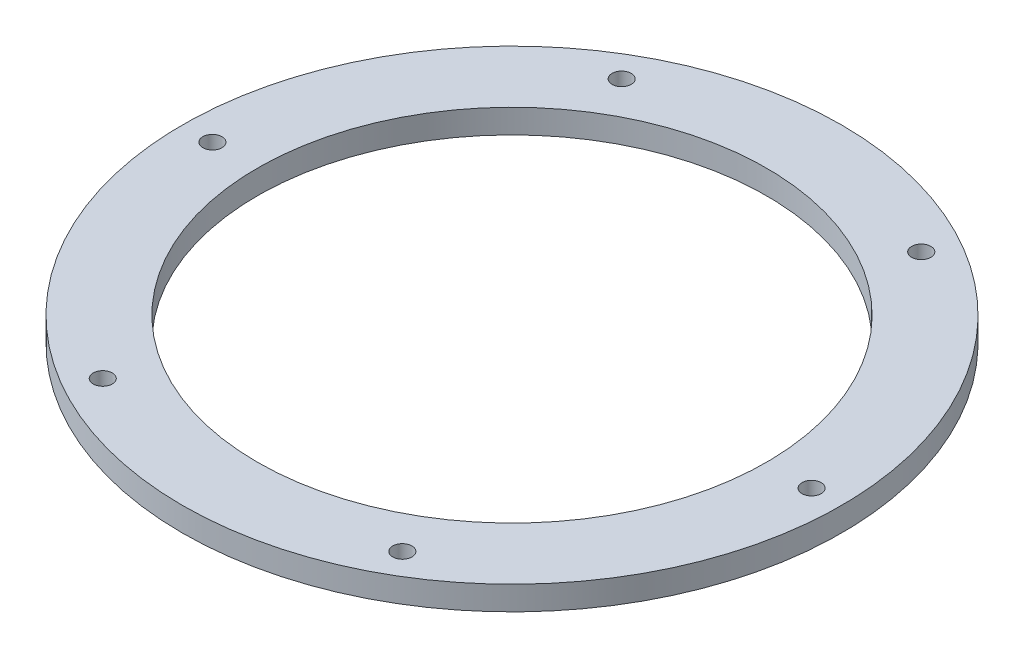
ISO-10303-21;
HEADER;
FILE_DESCRIPTION(('STEP AP214'),'2;1');
FILE_NAME('part.step','',(''),(''),'','','');
FILE_SCHEMA(('AUTOMOTIVE_DESIGN { 1 0 10303 214 1 1 1 1 }'));
ENDSEC;
DATA;
#1=APPLICATION_CONTEXT('core data for automotive mechanical design processes');
#2=APPLICATION_PROTOCOL_DEFINITION('international standard','automotive_design',2000,#1);
#3=PRODUCT_CONTEXT('',#1,'mechanical');
#4=PRODUCT('Part','Part','',(#3));
#5=PRODUCT_RELATED_PRODUCT_CATEGORY('part','',(#4));
#6=PRODUCT_DEFINITION_FORMATION('','',#4);
#7=PRODUCT_DEFINITION_CONTEXT('part definition',#1,'design');
#8=PRODUCT_DEFINITION('design','',#6,#7);
#9=PRODUCT_DEFINITION_SHAPE('','',#8);
#10=(LENGTH_UNIT() NAMED_UNIT(*) SI_UNIT(.MILLI.,.METRE.));
#11=(NAMED_UNIT(*) PLANE_ANGLE_UNIT() SI_UNIT($,.RADIAN.));
#12=(NAMED_UNIT(*) SI_UNIT($,.STERADIAN.) SOLID_ANGLE_UNIT());
#13=UNCERTAINTY_MEASURE_WITH_UNIT(LENGTH_MEASURE(1.E-05),#10,'distance_accuracy_value','');
#14=(GEOMETRIC_REPRESENTATION_CONTEXT(3) GLOBAL_UNCERTAINTY_ASSIGNED_CONTEXT((#13)) GLOBAL_UNIT_ASSIGNED_CONTEXT((#10,
#11,#12)) REPRESENTATION_CONTEXT('',''));
#15=CARTESIAN_POINT('',(0.,0.,0.));
#16=DIRECTION('',(0.,0.,1.));
#17=DIRECTION('',(1.,0.,0.));
#18=AXIS2_PLACEMENT_3D('',#15,#16,#17);
#19=CARTESIAN_POINT('',(0.,4.,0.));
#20=DIRECTION('',(0.,1.,0.));
#21=DIRECTION('',(0.,0.,1.));
#22=AXIS2_PLACEMENT_3D('',#19,#20,#21);
#23=PLANE('',#22);
#24=CARTESIAN_POINT('',(-50.,4.,0.));
#25=DIRECTION('',(0.,1.,0.));
#26=DIRECTION('',(0.,0.,1.));
#27=AXIS2_PLACEMENT_3D('',#24,#25,#26);
#28=CIRCLE('',#27,1.6);
#29=CARTESIAN_POINT('',(-50.,4.,1.60000000000002));
#30=VERTEX_POINT('',#29);
#31=EDGE_CURVE('E79',#30,#30,#28,.T.);
#32=ORIENTED_EDGE('',*,*,#31,.F.);
#33=EDGE_LOOP('',(#32));
#34=FACE_BOUND('',#33,.T.);
#35=CARTESIAN_POINT('',(25.,4.,43.3012701892219));
#36=DIRECTION('',(0.,1.,0.));
#37=DIRECTION('',(0.,0.,1.));
#38=AXIS2_PLACEMENT_3D('',#35,#36,#37);
#39=CIRCLE('',#38,1.6);
#40=CARTESIAN_POINT('',(25.,4.,44.9012701892219));
#41=VERTEX_POINT('',#40);
#42=EDGE_CURVE('E67',#41,#41,#39,.T.);
#43=ORIENTED_EDGE('',*,*,#42,.F.);
#44=EDGE_LOOP('',(#43));
#45=FACE_BOUND('',#44,.T.);
#46=CARTESIAN_POINT('',(25.,4.,-43.3012701892219));
#47=DIRECTION('',(0.,1.,0.));
#48=DIRECTION('',(0.,0.,1.));
#49=AXIS2_PLACEMENT_3D('',#46,#47,#48);
#50=CIRCLE('',#49,1.6);
#51=CARTESIAN_POINT('',(25.,4.,-41.7012701892219));
#52=VERTEX_POINT('',#51);
#53=EDGE_CURVE('E55',#52,#52,#50,.T.);
#54=ORIENTED_EDGE('',*,*,#53,.F.);
#55=EDGE_LOOP('',(#54));
#56=FACE_BOUND('',#55,.T.);
#57=CARTESIAN_POINT('',(0.,4.,0.));
#58=DIRECTION('',(0.,1.,0.));
#59=DIRECTION('',(0.,0.,1.));
#60=AXIS2_PLACEMENT_3D('',#57,#58,#59);
#61=CIRCLE('',#60,55.);
#62=CARTESIAN_POINT('',(0.,4.,55.));
#63=VERTEX_POINT('',#62);
#64=EDGE_CURVE('E10',#63,#63,#61,.T.);
#65=ORIENTED_EDGE('',*,*,#64,.T.);
#66=EDGE_LOOP('',(#65));
#67=FACE_BOUND('',#66,.T.);
#68=CARTESIAN_POINT('',(0.,4.,0.));
#69=DIRECTION('',(0.,1.,0.));
#70=DIRECTION('',(0.,0.,1.));
#71=AXIS2_PLACEMENT_3D('',#68,#69,#70);
#72=CIRCLE('',#71,42.5);
#73=CARTESIAN_POINT('',(0.,4.,42.5));
#74=VERTEX_POINT('',#73);
#75=EDGE_CURVE('E50',#74,#74,#72,.T.);
#76=ORIENTED_EDGE('',*,*,#75,.F.);
#77=EDGE_LOOP('',(#76));
#78=FACE_BOUND('',#77,.T.);
#79=CARTESIAN_POINT('',(50.,4.,0.));
#80=DIRECTION('',(0.,1.,0.));
#81=DIRECTION('',(0.,0.,1.));
#82=AXIS2_PLACEMENT_3D('',#79,#80,#81);
#83=CIRCLE('',#82,1.6);
#84=CARTESIAN_POINT('',(50.,4.,1.6));
#85=VERTEX_POINT('',#84);
#86=EDGE_CURVE('E61',#85,#85,#83,.T.);
#87=ORIENTED_EDGE('',*,*,#86,.F.);
#88=EDGE_LOOP('',(#87));
#89=FACE_BOUND('',#88,.T.);
#90=CARTESIAN_POINT('',(-25.,4.,43.3012701892219));
#91=DIRECTION('',(0.,1.,0.));
#92=DIRECTION('',(0.,0.,1.));
#93=AXIS2_PLACEMENT_3D('',#90,#91,#92);
#94=CIRCLE('',#93,1.6);
#95=CARTESIAN_POINT('',(-25.,4.,44.9012701892219));
#96=VERTEX_POINT('',#95);
#97=EDGE_CURVE('E73',#96,#96,#94,.T.);
#98=ORIENTED_EDGE('',*,*,#97,.F.);
#99=EDGE_LOOP('',(#98));
#100=FACE_BOUND('',#99,.T.);
#101=CARTESIAN_POINT('',(-25.,4.,-43.3012701892219));
#102=DIRECTION('',(0.,1.,0.));
#103=DIRECTION('',(0.,0.,1.));
#104=AXIS2_PLACEMENT_3D('',#101,#102,#103);
#105=CIRCLE('',#104,1.6);
#106=CARTESIAN_POINT('',(-25.,4.,-41.7012701892219));
#107=VERTEX_POINT('',#106);
#108=EDGE_CURVE('E85',#107,#107,#105,.T.);
#109=ORIENTED_EDGE('',*,*,#108,.F.);
#110=EDGE_LOOP('',(#109));
#111=FACE_BOUND('',#110,.T.);
#112=ADVANCED_FACE('F39',(#34,#45,#56,#67,#78,#89,#100,#111),#23,.T.);
#113=CARTESIAN_POINT('',(0.,0.,0.));
#114=DIRECTION('',(0.,1.,0.));
#115=DIRECTION('',(0.,0.,1.));
#116=AXIS2_PLACEMENT_3D('',#113,#114,#115);
#117=PLANE('',#116);
#118=CARTESIAN_POINT('',(0.,0.,0.));
#119=DIRECTION('',(0.,1.,0.));
#120=DIRECTION('',(0.,0.,1.));
#121=AXIS2_PLACEMENT_3D('',#118,#119,#120);
#122=CIRCLE('',#121,55.);
#123=CARTESIAN_POINT('',(0.,0.,55.));
#124=VERTEX_POINT('',#123);
#125=EDGE_CURVE('E43',#124,#124,#122,.T.);
#126=ORIENTED_EDGE('',*,*,#125,.F.);
#127=EDGE_LOOP('',(#126));
#128=FACE_BOUND('',#127,.T.);
#129=CARTESIAN_POINT('',(0.,0.,0.));
#130=DIRECTION('',(0.,1.,0.));
#131=DIRECTION('',(0.,0.,1.));
#132=AXIS2_PLACEMENT_3D('',#129,#130,#131);
#133=CIRCLE('',#132,42.5);
#134=CARTESIAN_POINT('',(0.,0.,42.5));
#135=VERTEX_POINT('',#134);
#136=EDGE_CURVE('E52',#135,#135,#133,.T.);
#137=ORIENTED_EDGE('',*,*,#136,.T.);
#138=EDGE_LOOP('',(#137));
#139=FACE_BOUND('',#138,.T.);
#140=CARTESIAN_POINT('',(25.,0.,-43.3012701892219));
#141=DIRECTION('',(0.,1.,0.));
#142=DIRECTION('',(0.,0.,1.));
#143=AXIS2_PLACEMENT_3D('',#140,#141,#142);
#144=CIRCLE('',#143,1.6);
#145=CARTESIAN_POINT('',(25.,0.,-41.7012701892219));
#146=VERTEX_POINT('',#145);
#147=EDGE_CURVE('E58',#146,#146,#144,.T.);
#148=ORIENTED_EDGE('',*,*,#147,.T.);
#149=EDGE_LOOP('',(#148));
#150=FACE_BOUND('',#149,.T.);
#151=CARTESIAN_POINT('',(50.,0.,0.));
#152=DIRECTION('',(0.,1.,0.));
#153=DIRECTION('',(0.,0.,1.));
#154=AXIS2_PLACEMENT_3D('',#151,#152,#153);
#155=CIRCLE('',#154,1.6);
#156=CARTESIAN_POINT('',(50.,0.,1.6));
#157=VERTEX_POINT('',#156);
#158=EDGE_CURVE('E64',#157,#157,#155,.T.);
#159=ORIENTED_EDGE('',*,*,#158,.T.);
#160=EDGE_LOOP('',(#159));
#161=FACE_BOUND('',#160,.T.);
#162=CARTESIAN_POINT('',(25.,0.,43.3012701892219));
#163=DIRECTION('',(0.,1.,0.));
#164=DIRECTION('',(0.,0.,1.));
#165=AXIS2_PLACEMENT_3D('',#162,#163,#164);
#166=CIRCLE('',#165,1.6);
#167=CARTESIAN_POINT('',(25.,0.,44.9012701892219));
#168=VERTEX_POINT('',#167);
#169=EDGE_CURVE('E70',#168,#168,#166,.T.);
#170=ORIENTED_EDGE('',*,*,#169,.T.);
#171=EDGE_LOOP('',(#170));
#172=FACE_BOUND('',#171,.T.);
#173=CARTESIAN_POINT('',(-25.,0.,43.3012701892219));
#174=DIRECTION('',(0.,1.,0.));
#175=DIRECTION('',(0.,0.,1.));
#176=AXIS2_PLACEMENT_3D('',#173,#174,#175);
#177=CIRCLE('',#176,1.6);
#178=CARTESIAN_POINT('',(-25.,0.,44.9012701892219));
#179=VERTEX_POINT('',#178);
#180=EDGE_CURVE('E76',#179,#179,#177,.T.);
#181=ORIENTED_EDGE('',*,*,#180,.T.);
#182=EDGE_LOOP('',(#181));
#183=FACE_BOUND('',#182,.T.);
#184=CARTESIAN_POINT('',(-50.,0.,0.));
#185=DIRECTION('',(0.,1.,0.));
#186=DIRECTION('',(0.,0.,1.));
#187=AXIS2_PLACEMENT_3D('',#184,#185,#186);
#188=CIRCLE('',#187,1.6);
#189=CARTESIAN_POINT('',(-50.,0.,1.60000000000002));
#190=VERTEX_POINT('',#189);
#191=EDGE_CURVE('E82',#190,#190,#188,.T.);
#192=ORIENTED_EDGE('',*,*,#191,.T.);
#193=EDGE_LOOP('',(#192));
#194=FACE_BOUND('',#193,.T.);
#195=CARTESIAN_POINT('',(-25.,0.,-43.3012701892219));
#196=DIRECTION('',(0.,1.,0.));
#197=DIRECTION('',(0.,0.,1.));
#198=AXIS2_PLACEMENT_3D('',#195,#196,#197);
#199=CIRCLE('',#198,1.6);
#200=CARTESIAN_POINT('',(-25.,0.,-41.7012701892219));
#201=VERTEX_POINT('',#200);
#202=EDGE_CURVE('E88',#201,#201,#199,.T.);
#203=ORIENTED_EDGE('',*,*,#202,.T.);
#204=EDGE_LOOP('',(#203));
#205=FACE_BOUND('',#204,.T.);
#206=ADVANCED_FACE('F98',(#128,#139,#150,#161,#172,#183,#194,#205),#117,.F.);
#207=CARTESIAN_POINT('',(0.,4.,0.));
#208=DIRECTION('',(0.,-1.,0.));
#209=DIRECTION('',(0.,0.,-1.));
#210=AXIS2_PLACEMENT_3D('',#207,#208,#209);
#211=CYLINDRICAL_SURFACE('',#210,55.);
#212=ORIENTED_EDGE('',*,*,#64,.F.);
#213=EDGE_LOOP('',(#212));
#214=FACE_BOUND('',#213,.T.);
#215=ORIENTED_EDGE('',*,*,#125,.T.);
#216=EDGE_LOOP('',(#215));
#217=FACE_BOUND('',#216,.T.);
#218=ADVANCED_FACE('F41',(#214,#217),#211,.T.);
#219=CARTESIAN_POINT('',(0.,4.,0.));
#220=DIRECTION('',(0.,-1.,0.));
#221=DIRECTION('',(0.,0.,-1.));
#222=AXIS2_PLACEMENT_3D('',#219,#220,#221);
#223=CYLINDRICAL_SURFACE('',#222,42.5);
#224=ORIENTED_EDGE('',*,*,#75,.T.);
#225=EDGE_LOOP('',(#224));
#226=FACE_BOUND('',#225,.T.);
#227=ORIENTED_EDGE('',*,*,#136,.F.);
#228=EDGE_LOOP('',(#227));
#229=FACE_BOUND('',#228,.T.);
#230=ADVANCED_FACE('F108',(#226,#229),#223,.F.);
#231=CARTESIAN_POINT('',(25.,4.,-43.3012701892219));
#232=DIRECTION('',(0.,-1.,0.));
#233=DIRECTION('',(0.,0.,-1.));
#234=AXIS2_PLACEMENT_3D('',#231,#232,#233);
#235=CYLINDRICAL_SURFACE('',#234,1.6);
#236=ORIENTED_EDGE('',*,*,#53,.T.);
#237=EDGE_LOOP('',(#236));
#238=FACE_BOUND('',#237,.T.);
#239=ORIENTED_EDGE('',*,*,#147,.F.);
#240=EDGE_LOOP('',(#239));
#241=FACE_BOUND('',#240,.T.);
#242=ADVANCED_FACE('F111',(#238,#241),#235,.F.);
#243=CARTESIAN_POINT('',(50.,4.,0.));
#244=DIRECTION('',(0.,-1.,0.));
#245=DIRECTION('',(0.,0.,-1.));
#246=AXIS2_PLACEMENT_3D('',#243,#244,#245);
#247=CYLINDRICAL_SURFACE('',#246,1.6);
#248=ORIENTED_EDGE('',*,*,#86,.T.);
#249=EDGE_LOOP('',(#248));
#250=FACE_BOUND('',#249,.T.);
#251=ORIENTED_EDGE('',*,*,#158,.F.);
#252=EDGE_LOOP('',(#251));
#253=FACE_BOUND('',#252,.T.);
#254=ADVANCED_FACE('F115',(#250,#253),#247,.F.);
#255=CARTESIAN_POINT('',(25.,4.,43.3012701892219));
#256=DIRECTION('',(0.,-1.,0.));
#257=DIRECTION('',(0.,0.,-1.));
#258=AXIS2_PLACEMENT_3D('',#255,#256,#257);
#259=CYLINDRICAL_SURFACE('',#258,1.6);
#260=ORIENTED_EDGE('',*,*,#42,.T.);
#261=EDGE_LOOP('',(#260));
#262=FACE_BOUND('',#261,.T.);
#263=ORIENTED_EDGE('',*,*,#169,.F.);
#264=EDGE_LOOP('',(#263));
#265=FACE_BOUND('',#264,.T.);
#266=ADVANCED_FACE('F119',(#262,#265),#259,.F.);
#267=CARTESIAN_POINT('',(-25.,4.,43.3012701892219));
#268=DIRECTION('',(0.,-1.,0.));
#269=DIRECTION('',(0.,0.,-1.));
#270=AXIS2_PLACEMENT_3D('',#267,#268,#269);
#271=CYLINDRICAL_SURFACE('',#270,1.6);
#272=ORIENTED_EDGE('',*,*,#97,.T.);
#273=EDGE_LOOP('',(#272));
#274=FACE_BOUND('',#273,.T.);
#275=ORIENTED_EDGE('',*,*,#180,.F.);
#276=EDGE_LOOP('',(#275));
#277=FACE_BOUND('',#276,.T.);
#278=ADVANCED_FACE('F123',(#274,#277),#271,.F.);
#279=CARTESIAN_POINT('',(-50.,4.,0.));
#280=DIRECTION('',(0.,-1.,0.));
#281=DIRECTION('',(0.,0.,-1.));
#282=AXIS2_PLACEMENT_3D('',#279,#280,#281);
#283=CYLINDRICAL_SURFACE('',#282,1.6);
#284=ORIENTED_EDGE('',*,*,#31,.T.);
#285=EDGE_LOOP('',(#284));
#286=FACE_BOUND('',#285,.T.);
#287=ORIENTED_EDGE('',*,*,#191,.F.);
#288=EDGE_LOOP('',(#287));
#289=FACE_BOUND('',#288,.T.);
#290=ADVANCED_FACE('F127',(#286,#289),#283,.F.);
#291=CARTESIAN_POINT('',(-25.,4.,-43.3012701892219));
#292=DIRECTION('',(0.,-1.,0.));
#293=DIRECTION('',(0.,0.,-1.));
#294=AXIS2_PLACEMENT_3D('',#291,#292,#293);
#295=CYLINDRICAL_SURFACE('',#294,1.6);
#296=ORIENTED_EDGE('',*,*,#108,.T.);
#297=EDGE_LOOP('',(#296));
#298=FACE_BOUND('',#297,.T.);
#299=ORIENTED_EDGE('',*,*,#202,.F.);
#300=EDGE_LOOP('',(#299));
#301=FACE_BOUND('',#300,.T.);
#302=ADVANCED_FACE('F94',(#298,#301),#295,.F.);
#303=CLOSED_SHELL('',(#112,#206,#218,#230,#242,#254,#266,#278,#290,#302));
#304=MANIFOLD_SOLID_BREP('B2',#303);
#305=ADVANCED_BREP_SHAPE_REPRESENTATION('',(#18,#304),#14);
#306=SHAPE_DEFINITION_REPRESENTATION(#9,#305);
ENDSEC;
END-ISO-10303-21;
